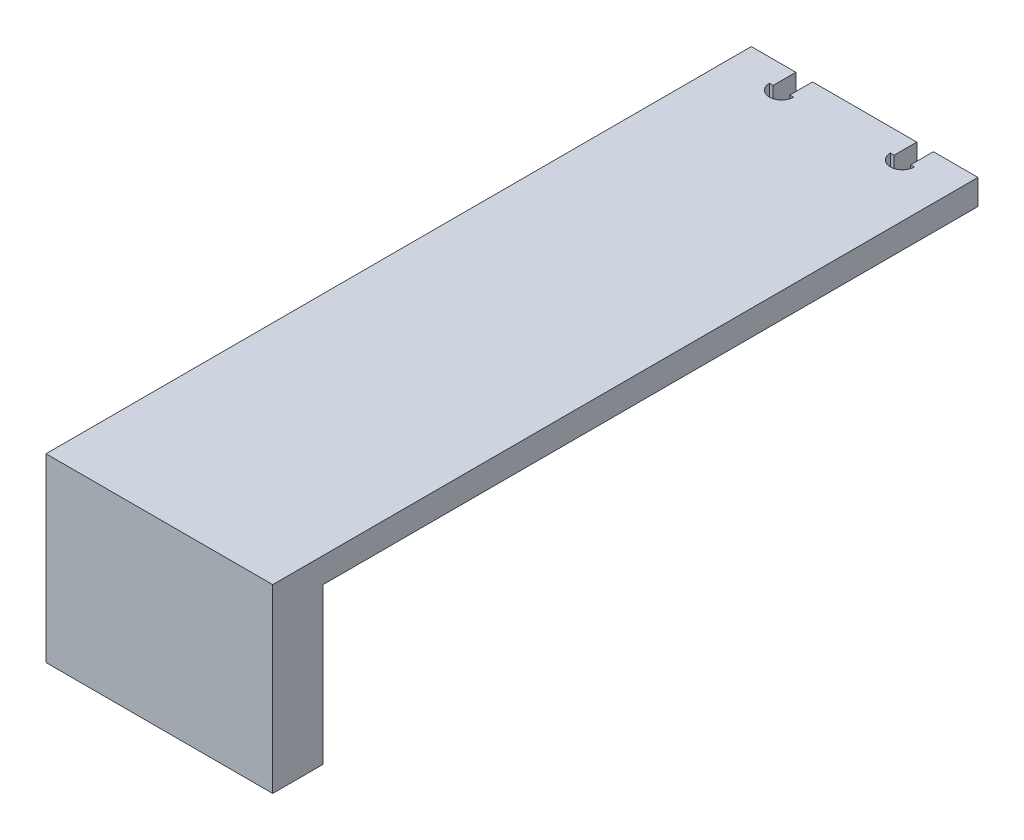
ISO-10303-21;
HEADER;
FILE_DESCRIPTION(('STEP AP214'),'2;1');
FILE_NAME('part.step','',(''),(''),'','','');
FILE_SCHEMA(('AUTOMOTIVE_DESIGN { 1 0 10303 214 1 1 1 1 }'));
ENDSEC;
DATA;
#1=APPLICATION_CONTEXT('core data for automotive mechanical design processes');
#2=APPLICATION_PROTOCOL_DEFINITION('international standard','automotive_design',2000,#1);
#3=PRODUCT_CONTEXT('',#1,'mechanical');
#4=PRODUCT('Part','Part','',(#3));
#5=PRODUCT_RELATED_PRODUCT_CATEGORY('part','',(#4));
#6=PRODUCT_DEFINITION_FORMATION('','',#4);
#7=PRODUCT_DEFINITION_CONTEXT('part definition',#1,'design');
#8=PRODUCT_DEFINITION('design','',#6,#7);
#9=PRODUCT_DEFINITION_SHAPE('','',#8);
#10=(LENGTH_UNIT() NAMED_UNIT(*) SI_UNIT(.MILLI.,.METRE.));
#11=(NAMED_UNIT(*) PLANE_ANGLE_UNIT() SI_UNIT($,.RADIAN.));
#12=(NAMED_UNIT(*) SI_UNIT($,.STERADIAN.) SOLID_ANGLE_UNIT());
#13=UNCERTAINTY_MEASURE_WITH_UNIT(LENGTH_MEASURE(1.E-05),#10,'distance_accuracy_value','');
#14=(GEOMETRIC_REPRESENTATION_CONTEXT(3) GLOBAL_UNCERTAINTY_ASSIGNED_CONTEXT((#13)) GLOBAL_UNIT_ASSIGNED_CONTEXT((#10,
#11,#12)) REPRESENTATION_CONTEXT('',''));
#15=CARTESIAN_POINT('',(0.,0.,0.));
#16=DIRECTION('',(0.,0.,1.));
#17=DIRECTION('',(1.,0.,0.));
#18=AXIS2_PLACEMENT_3D('',#15,#16,#17);
#19=CARTESIAN_POINT('',(0.,2.5,-65.));
#20=DIRECTION('',(0.,0.,-1.));
#21=DIRECTION('',(-1.,0.,0.));
#22=AXIS2_PLACEMENT_3D('',#19,#20,#21);
#23=PLANE('',#22);
#24=DIRECTION('',(1.,0.,0.));
#25=VECTOR('',#24,1.);
#26=CARTESIAN_POINT('',(0.,-2.5,-65.));
#27=LINE('',#26,#25);
#28=CARTESIAN_POINT('',(-22.5,-2.5,-65.));
#29=VERTEX_POINT('',#28);
#30=CARTESIAN_POINT('',(-13.65,-2.5,-65.));
#31=VERTEX_POINT('',#30);
#32=EDGE_CURVE('E193',#29,#31,#27,.T.);
#33=ORIENTED_EDGE('',*,*,#32,.F.);
#34=DIRECTION('',(0.,1.,0.));
#35=VECTOR('',#34,1.);
#36=CARTESIAN_POINT('',(-22.5,-117.5,-65.));
#37=LINE('',#36,#35);
#38=CARTESIAN_POINT('',(-22.5,2.5,-65.));
#39=VERTEX_POINT('',#38);
#40=EDGE_CURVE('E55',#29,#39,#37,.T.);
#41=ORIENTED_EDGE('',*,*,#40,.T.);
#42=DIRECTION('',(1.,0.,0.));
#43=VECTOR('',#42,1.);
#44=CARTESIAN_POINT('',(0.,2.5,-65.));
#45=LINE('',#44,#43);
#46=CARTESIAN_POINT('',(-13.65,2.5,-65.));
#47=VERTEX_POINT('',#46);
#48=EDGE_CURVE('E147',#39,#47,#45,.T.);
#49=ORIENTED_EDGE('',*,*,#48,.T.);
#50=DIRECTION('',(0.,-1.,0.));
#51=VECTOR('',#50,1.);
#52=CARTESIAN_POINT('',(-13.65,2.5,-65.));
#53=LINE('',#52,#51);
#54=EDGE_CURVE('E150',#47,#31,#53,.T.);
#55=ORIENTED_EDGE('',*,*,#54,.T.);
#56=EDGE_LOOP('',(#33,#41,#49,#55));
#57=FACE_BOUND('',#56,.T.);
#58=ADVANCED_FACE('F41',(#57),#23,.T.);
#59=CARTESIAN_POINT('',(13.65,2.5,-65.));
#60=VERTEX_POINT('',#59);
#61=CARTESIAN_POINT('',(22.5,2.5,-65.));
#62=VERTEX_POINT('',#61);
#63=EDGE_CURVE('E155',#60,#62,#45,.T.);
#64=ORIENTED_EDGE('',*,*,#63,.T.);
#65=DIRECTION('',(0.,1.,0.));
#66=VECTOR('',#65,1.);
#67=CARTESIAN_POINT('',(22.5,-117.5,-65.));
#68=LINE('',#67,#66);
#69=CARTESIAN_POINT('',(22.5,-2.5,-65.));
#70=VERTEX_POINT('',#69);
#71=EDGE_CURVE('E242',#70,#62,#68,.T.);
#72=ORIENTED_EDGE('',*,*,#71,.F.);
#73=CARTESIAN_POINT('',(13.65,-2.5,-65.));
#74=VERTEX_POINT('',#73);
#75=EDGE_CURVE('E194',#74,#70,#27,.T.);
#76=ORIENTED_EDGE('',*,*,#75,.F.);
#77=DIRECTION('',(0.,-1.,0.));
#78=VECTOR('',#77,1.);
#79=CARTESIAN_POINT('',(13.65,2.5,-65.));
#80=LINE('',#79,#78);
#81=EDGE_CURVE('E165',#60,#74,#80,.T.);
#82=ORIENTED_EDGE('',*,*,#81,.F.);
#83=EDGE_LOOP('',(#64,#72,#76,#82));
#84=FACE_BOUND('',#83,.T.);
#85=ADVANCED_FACE('F254',(#84),#23,.T.);
#86=CARTESIAN_POINT('',(0.,2.5,0.));
#87=DIRECTION('',(0.,1.,0.));
#88=DIRECTION('',(0.,0.,1.));
#89=AXIS2_PLACEMENT_3D('',#86,#87,#88);
#90=PLANE('',#89);
#91=ORIENTED_EDGE('',*,*,#48,.F.);
#92=DIRECTION('',(0.,0.,1.));
#93=VECTOR('',#92,1.);
#94=CARTESIAN_POINT('',(-22.5,2.5,0.));
#95=LINE('',#94,#93);
#96=CARTESIAN_POINT('',(-22.5,2.5,75.));
#97=VERTEX_POINT('',#96);
#98=EDGE_CURVE('E255',#39,#97,#95,.T.);
#99=ORIENTED_EDGE('',*,*,#98,.T.);
#100=DIRECTION('',(-1.,0.,0.));
#101=VECTOR('',#100,1.);
#102=CARTESIAN_POINT('',(22.5,2.5,75.));
#103=LINE('',#102,#101);
#104=CARTESIAN_POINT('',(22.5,2.5,75.));
#105=VERTEX_POINT('',#104);
#106=EDGE_CURVE('E288',#105,#97,#103,.T.);
#107=ORIENTED_EDGE('',*,*,#106,.F.);
#108=DIRECTION('',(0.,0.,-1.));
#109=VECTOR('',#108,1.);
#110=CARTESIAN_POINT('',(22.5,2.5,0.));
#111=LINE('',#110,#109);
#112=EDGE_CURVE('E256',#105,#62,#111,.T.);
#113=ORIENTED_EDGE('',*,*,#112,.T.);
#114=ORIENTED_EDGE('',*,*,#63,.F.);
#115=DIRECTION('',(0.,0.,1.));
#116=VECTOR('',#115,1.);
#117=CARTESIAN_POINT('',(13.65,2.5,0.));
#118=LINE('',#117,#116);
#119=CARTESIAN_POINT('',(13.65,2.5,-60.5));
#120=VERTEX_POINT('',#119);
#121=EDGE_CURVE('E64',#60,#120,#118,.T.);
#122=ORIENTED_EDGE('',*,*,#121,.T.);
#123=DIRECTION('',(1.,0.,0.));
#124=VECTOR('',#123,1.);
#125=CARTESIAN_POINT('',(0.,2.5,-60.5));
#126=LINE('',#125,#124);
#127=CARTESIAN_POINT('',(14.4,2.5,-60.5));
#128=VERTEX_POINT('',#127);
#129=EDGE_CURVE('E211',#120,#128,#126,.T.);
#130=ORIENTED_EDGE('',*,*,#129,.T.);
#131=CARTESIAN_POINT('',(12.,2.5,-60.5));
#132=DIRECTION('',(0.,1.,0.));
#133=DIRECTION('',(0.,0.,1.));
#134=AXIS2_PLACEMENT_3D('',#131,#132,#133);
#135=CIRCLE('',#134,2.4);
#136=CARTESIAN_POINT('',(9.60000000000001,2.5,-60.5));
#137=VERTEX_POINT('',#136);
#138=EDGE_CURVE('E118',#128,#137,#135,.F.);
#139=ORIENTED_EDGE('',*,*,#138,.T.);
#140=DIRECTION('',(1.,0.,0.));
#141=VECTOR('',#140,1.);
#142=CARTESIAN_POINT('',(0.,2.5,-60.5));
#143=LINE('',#142,#141);
#144=CARTESIAN_POINT('',(10.35,2.5,-60.5));
#145=VERTEX_POINT('',#144);
#146=EDGE_CURVE('E296',#137,#145,#143,.T.);
#147=ORIENTED_EDGE('',*,*,#146,.T.);
#148=DIRECTION('',(0.,0.,-1.));
#149=VECTOR('',#148,1.);
#150=CARTESIAN_POINT('',(10.35,2.5,0.));
#151=LINE('',#150,#149);
#152=CARTESIAN_POINT('',(10.35,2.5,-65.));
#153=VERTEX_POINT('',#152);
#154=EDGE_CURVE('E298',#145,#153,#151,.T.);
#155=ORIENTED_EDGE('',*,*,#154,.T.);
#156=CARTESIAN_POINT('',(-10.35,2.5,-65.));
#157=VERTEX_POINT('',#156);
#158=EDGE_CURVE('E158',#157,#153,#45,.T.);
#159=ORIENTED_EDGE('',*,*,#158,.F.);
#160=DIRECTION('',(0.,0.,-1.));
#161=VECTOR('',#160,1.);
#162=CARTESIAN_POINT('',(-10.35,2.5,0.));
#163=LINE('',#162,#161);
#164=CARTESIAN_POINT('',(-10.35,2.5,-60.5));
#165=VERTEX_POINT('',#164);
#166=EDGE_CURVE('E301',#165,#157,#163,.T.);
#167=ORIENTED_EDGE('',*,*,#166,.F.);
#168=DIRECTION('',(-1.,0.,0.));
#169=VECTOR('',#168,1.);
#170=CARTESIAN_POINT('',(0.,2.5,-60.5));
#171=LINE('',#170,#169);
#172=CARTESIAN_POINT('',(-9.6,2.5,-60.5));
#173=VERTEX_POINT('',#172);
#174=EDGE_CURVE('E304',#173,#165,#171,.T.);
#175=ORIENTED_EDGE('',*,*,#174,.F.);
#176=CARTESIAN_POINT('',(-12.,2.5,-60.5));
#177=DIRECTION('',(0.,1.,0.));
#178=DIRECTION('',(0.,0.,1.));
#179=AXIS2_PLACEMENT_3D('',#176,#177,#178);
#180=CIRCLE('',#179,2.4);
#181=CARTESIAN_POINT('',(-14.4,2.5,-60.5));
#182=VERTEX_POINT('',#181);
#183=EDGE_CURVE('E173',#182,#173,#180,.T.);
#184=ORIENTED_EDGE('',*,*,#183,.F.);
#185=DIRECTION('',(-1.,0.,0.));
#186=VECTOR('',#185,1.);
#187=CARTESIAN_POINT('',(0.,2.5,-60.5));
#188=LINE('',#187,#186);
#189=CARTESIAN_POINT('',(-13.65,2.5,-60.5));
#190=VERTEX_POINT('',#189);
#191=EDGE_CURVE('E171',#190,#182,#188,.T.);
#192=ORIENTED_EDGE('',*,*,#191,.F.);
#193=DIRECTION('',(0.,0.,1.));
#194=VECTOR('',#193,1.);
#195=CARTESIAN_POINT('',(-13.65,2.5,0.));
#196=LINE('',#195,#194);
#197=EDGE_CURVE('E156',#47,#190,#196,.T.);
#198=ORIENTED_EDGE('',*,*,#197,.F.);
#199=EDGE_LOOP('',(#91,#99,#107,#113,#114,#122,#130,#139,#147,#155,#159,#167,#175,#184,#192,#198));
#200=FACE_BOUND('',#199,.T.);
#201=ADVANCED_FACE('F168',(#200),#90,.T.);
#202=CARTESIAN_POINT('',(0.,-2.5,0.));
#203=DIRECTION('',(0.,1.,0.));
#204=DIRECTION('',(0.,0.,1.));
#205=AXIS2_PLACEMENT_3D('',#202,#203,#204);
#206=PLANE('',#205);
#207=DIRECTION('',(0.,0.,1.));
#208=VECTOR('',#207,1.);
#209=CARTESIAN_POINT('',(-22.5,-2.5,0.));
#210=LINE('',#209,#208);
#211=CARTESIAN_POINT('',(-22.5,-2.5,65.));
#212=VERTEX_POINT('',#211);
#213=EDGE_CURVE('E11',#29,#212,#210,.T.);
#214=ORIENTED_EDGE('',*,*,#213,.F.);
#215=ORIENTED_EDGE('',*,*,#32,.T.);
#216=DIRECTION('',(0.,0.,1.));
#217=VECTOR('',#216,1.);
#218=CARTESIAN_POINT('',(-13.65,-2.5,0.));
#219=LINE('',#218,#217);
#220=CARTESIAN_POINT('',(-13.65,-2.5,-60.5));
#221=VERTEX_POINT('',#220);
#222=EDGE_CURVE('E163',#31,#221,#219,.T.);
#223=ORIENTED_EDGE('',*,*,#222,.T.);
#224=DIRECTION('',(-1.,0.,0.));
#225=VECTOR('',#224,1.);
#226=CARTESIAN_POINT('',(0.,-2.5,-60.5));
#227=LINE('',#226,#225);
#228=CARTESIAN_POINT('',(-14.4,-2.5,-60.5));
#229=VERTEX_POINT('',#228);
#230=EDGE_CURVE('E203',#221,#229,#227,.T.);
#231=ORIENTED_EDGE('',*,*,#230,.T.);
#232=CARTESIAN_POINT('',(-12.,-2.5,-60.5));
#233=DIRECTION('',(0.,1.,0.));
#234=DIRECTION('',(0.,0.,1.));
#235=AXIS2_PLACEMENT_3D('',#232,#233,#234);
#236=CIRCLE('',#235,2.4);
#237=CARTESIAN_POINT('',(-9.6,-2.5,-60.5));
#238=VERTEX_POINT('',#237);
#239=EDGE_CURVE('E200',#229,#238,#236,.T.);
#240=ORIENTED_EDGE('',*,*,#239,.T.);
#241=DIRECTION('',(-1.,0.,0.));
#242=VECTOR('',#241,1.);
#243=CARTESIAN_POINT('',(0.,-2.5,-60.5));
#244=LINE('',#243,#242);
#245=CARTESIAN_POINT('',(-10.35,-2.5,-60.5));
#246=VERTEX_POINT('',#245);
#247=EDGE_CURVE('E197',#238,#246,#244,.T.);
#248=ORIENTED_EDGE('',*,*,#247,.T.);
#249=DIRECTION('',(0.,0.,-1.));
#250=VECTOR('',#249,1.);
#251=CARTESIAN_POINT('',(-10.35,-2.5,0.));
#252=LINE('',#251,#250);
#253=CARTESIAN_POINT('',(-10.35,-2.5,-65.));
#254=VERTEX_POINT('',#253);
#255=EDGE_CURVE('E192',#246,#254,#252,.T.);
#256=ORIENTED_EDGE('',*,*,#255,.T.);
#257=CARTESIAN_POINT('',(10.35,-2.5,-65.));
#258=VERTEX_POINT('',#257);
#259=EDGE_CURVE('E189',#254,#258,#27,.T.);
#260=ORIENTED_EDGE('',*,*,#259,.T.);
#261=DIRECTION('',(0.,0.,-1.));
#262=VECTOR('',#261,1.);
#263=CARTESIAN_POINT('',(10.35,-2.5,0.));
#264=LINE('',#263,#262);
#265=CARTESIAN_POINT('',(10.35,-2.5,-60.5));
#266=VERTEX_POINT('',#265);
#267=EDGE_CURVE('E186',#266,#258,#264,.T.);
#268=ORIENTED_EDGE('',*,*,#267,.F.);
#269=DIRECTION('',(1.,0.,0.));
#270=VECTOR('',#269,1.);
#271=CARTESIAN_POINT('',(0.,-2.5,-60.5));
#272=LINE('',#271,#270);
#273=CARTESIAN_POINT('',(9.60000000000001,-2.5,-60.5));
#274=VERTEX_POINT('',#273);
#275=EDGE_CURVE('E184',#274,#266,#272,.T.);
#276=ORIENTED_EDGE('',*,*,#275,.F.);
#277=CARTESIAN_POINT('',(12.,-2.5,-60.5));
#278=DIRECTION('',(0.,1.,0.));
#279=DIRECTION('',(0.,0.,1.));
#280=AXIS2_PLACEMENT_3D('',#277,#278,#279);
#281=CIRCLE('',#280,2.4);
#282=CARTESIAN_POINT('',(14.4,-2.5,-60.5));
#283=VERTEX_POINT('',#282);
#284=EDGE_CURVE('E182',#283,#274,#281,.F.);
#285=ORIENTED_EDGE('',*,*,#284,.F.);
#286=DIRECTION('',(1.,0.,0.));
#287=VECTOR('',#286,1.);
#288=CARTESIAN_POINT('',(0.,-2.5,-60.5));
#289=LINE('',#288,#287);
#290=CARTESIAN_POINT('',(13.65,-2.5,-60.5));
#291=VERTEX_POINT('',#290);
#292=EDGE_CURVE('E179',#291,#283,#289,.T.);
#293=ORIENTED_EDGE('',*,*,#292,.F.);
#294=DIRECTION('',(0.,0.,1.));
#295=VECTOR('',#294,1.);
#296=CARTESIAN_POINT('',(13.65,-2.5,0.));
#297=LINE('',#296,#295);
#298=EDGE_CURVE('E109',#74,#291,#297,.T.);
#299=ORIENTED_EDGE('',*,*,#298,.F.);
#300=ORIENTED_EDGE('',*,*,#75,.T.);
#301=DIRECTION('',(0.,0.,-1.));
#302=VECTOR('',#301,1.);
#303=CARTESIAN_POINT('',(22.5,-2.5,0.));
#304=LINE('',#303,#302);
#305=CARTESIAN_POINT('',(22.5,-2.5,65.));
#306=VERTEX_POINT('',#305);
#307=EDGE_CURVE('E49',#306,#70,#304,.T.);
#308=ORIENTED_EDGE('',*,*,#307,.F.);
#309=DIRECTION('',(1.,0.,0.));
#310=VECTOR('',#309,1.);
#311=CARTESIAN_POINT('',(0.,-2.5,65.));
#312=LINE('',#311,#310);
#313=EDGE_CURVE('E207',#212,#306,#312,.T.);
#314=ORIENTED_EDGE('',*,*,#313,.F.);
#315=EDGE_LOOP('',(#214,#215,#223,#231,#240,#248,#256,#260,#268,#276,#285,#293,#299,#300,#308,#314));
#316=FACE_BOUND('',#315,.T.);
#317=ADVANCED_FACE('F258',(#316),#206,.F.);
#318=CARTESIAN_POINT('',(0.,2.5,-60.5));
#319=DIRECTION('',(0.,0.,-1.));
#320=DIRECTION('',(-1.,0.,0.));
#321=AXIS2_PLACEMENT_3D('',#318,#319,#320);
#322=PLANE('',#321);
#323=ORIENTED_EDGE('',*,*,#292,.T.);
#324=DIRECTION('',(0.,-1.,0.));
#325=VECTOR('',#324,1.);
#326=CARTESIAN_POINT('',(14.4,2.5,-60.5));
#327=LINE('',#326,#325);
#328=EDGE_CURVE('E231',#128,#283,#327,.T.);
#329=ORIENTED_EDGE('',*,*,#328,.F.);
#330=ORIENTED_EDGE('',*,*,#129,.F.);
#331=DIRECTION('',(0.,-1.,0.));
#332=VECTOR('',#331,1.);
#333=CARTESIAN_POINT('',(13.65,2.5,-60.5));
#334=LINE('',#333,#332);
#335=EDGE_CURVE('E178',#120,#291,#334,.T.);
#336=ORIENTED_EDGE('',*,*,#335,.T.);
#337=EDGE_LOOP('',(#323,#329,#330,#336));
#338=FACE_BOUND('',#337,.T.);
#339=ADVANCED_FACE('F43',(#338),#322,.F.);
#340=CARTESIAN_POINT('',(12.,2.5,-60.5));
#341=DIRECTION('',(0.,-1.,0.));
#342=DIRECTION('',(0.,0.,-1.));
#343=AXIS2_PLACEMENT_3D('',#340,#341,#342);
#344=CYLINDRICAL_SURFACE('',#343,2.4);
#345=ORIENTED_EDGE('',*,*,#284,.T.);
#346=DIRECTION('',(0.,-1.,0.));
#347=VECTOR('',#346,1.);
#348=CARTESIAN_POINT('',(9.60000000000001,2.5,-60.5));
#349=LINE('',#348,#347);
#350=EDGE_CURVE('E228',#137,#274,#349,.T.);
#351=ORIENTED_EDGE('',*,*,#350,.F.);
#352=ORIENTED_EDGE('',*,*,#138,.F.);
#353=ORIENTED_EDGE('',*,*,#328,.T.);
#354=EDGE_LOOP('',(#345,#351,#352,#353));
#355=FACE_BOUND('',#354,.T.);
#356=ADVANCED_FACE('F335',(#355),#344,.F.);
#357=CARTESIAN_POINT('',(0.,2.5,-60.5));
#358=DIRECTION('',(0.,0.,-1.));
#359=DIRECTION('',(-1.,0.,0.));
#360=AXIS2_PLACEMENT_3D('',#357,#358,#359);
#361=PLANE('',#360);
#362=ORIENTED_EDGE('',*,*,#275,.T.);
#363=DIRECTION('',(0.,-1.,0.));
#364=VECTOR('',#363,1.);
#365=CARTESIAN_POINT('',(10.35,2.5,-60.5));
#366=LINE('',#365,#364);
#367=EDGE_CURVE('E225',#145,#266,#366,.T.);
#368=ORIENTED_EDGE('',*,*,#367,.F.);
#369=ORIENTED_EDGE('',*,*,#146,.F.);
#370=ORIENTED_EDGE('',*,*,#350,.T.);
#371=EDGE_LOOP('',(#362,#368,#369,#370));
#372=FACE_BOUND('',#371,.T.);
#373=ADVANCED_FACE('F334',(#372),#361,.F.);
#374=CARTESIAN_POINT('',(10.35,2.5,0.));
#375=DIRECTION('',(-1.,0.,0.));
#376=DIRECTION('',(0.,0.,1.));
#377=AXIS2_PLACEMENT_3D('',#374,#375,#376);
#378=PLANE('',#377);
#379=ORIENTED_EDGE('',*,*,#267,.T.);
#380=DIRECTION('',(0.,-1.,0.));
#381=VECTOR('',#380,1.);
#382=CARTESIAN_POINT('',(10.35,2.5,-65.));
#383=LINE('',#382,#381);
#384=EDGE_CURVE('E223',#153,#258,#383,.T.);
#385=ORIENTED_EDGE('',*,*,#384,.F.);
#386=ORIENTED_EDGE('',*,*,#154,.F.);
#387=ORIENTED_EDGE('',*,*,#367,.T.);
#388=EDGE_LOOP('',(#379,#385,#386,#387));
#389=FACE_BOUND('',#388,.T.);
#390=ADVANCED_FACE('F329',(#389),#378,.F.);
#391=ORIENTED_EDGE('',*,*,#259,.F.);
#392=DIRECTION('',(0.,-1.,0.));
#393=VECTOR('',#392,1.);
#394=CARTESIAN_POINT('',(-10.35,2.5,-65.));
#395=LINE('',#394,#393);
#396=EDGE_CURVE('E221',#157,#254,#395,.T.);
#397=ORIENTED_EDGE('',*,*,#396,.F.);
#398=ORIENTED_EDGE('',*,*,#158,.T.);
#399=ORIENTED_EDGE('',*,*,#384,.T.);
#400=EDGE_LOOP('',(#391,#397,#398,#399));
#401=FACE_BOUND('',#400,.T.);
#402=ADVANCED_FACE('F324',(#401),#23,.T.);
#403=CARTESIAN_POINT('',(-10.35,2.5,0.));
#404=DIRECTION('',(-1.,0.,0.));
#405=DIRECTION('',(0.,0.,1.));
#406=AXIS2_PLACEMENT_3D('',#403,#404,#405);
#407=PLANE('',#406);
#408=ORIENTED_EDGE('',*,*,#255,.F.);
#409=DIRECTION('',(0.,-1.,0.));
#410=VECTOR('',#409,1.);
#411=CARTESIAN_POINT('',(-10.35,2.5,-60.5));
#412=LINE('',#411,#410);
#413=EDGE_CURVE('E219',#165,#246,#412,.T.);
#414=ORIENTED_EDGE('',*,*,#413,.F.);
#415=ORIENTED_EDGE('',*,*,#166,.T.);
#416=ORIENTED_EDGE('',*,*,#396,.T.);
#417=EDGE_LOOP('',(#408,#414,#415,#416));
#418=FACE_BOUND('',#417,.T.);
#419=ADVANCED_FACE('F320',(#418),#407,.T.);
#420=CARTESIAN_POINT('',(0.,2.5,-60.5));
#421=DIRECTION('',(0.,0.,1.));
#422=DIRECTION('',(1.,0.,0.));
#423=AXIS2_PLACEMENT_3D('',#420,#421,#422);
#424=PLANE('',#423);
#425=ORIENTED_EDGE('',*,*,#247,.F.);
#426=DIRECTION('',(0.,-1.,0.));
#427=VECTOR('',#426,1.);
#428=CARTESIAN_POINT('',(-9.6,2.5,-60.5));
#429=LINE('',#428,#427);
#430=EDGE_CURVE('E217',#173,#238,#429,.T.);
#431=ORIENTED_EDGE('',*,*,#430,.F.);
#432=ORIENTED_EDGE('',*,*,#174,.T.);
#433=ORIENTED_EDGE('',*,*,#413,.T.);
#434=EDGE_LOOP('',(#425,#431,#432,#433));
#435=FACE_BOUND('',#434,.T.);
#436=ADVANCED_FACE('F318',(#435),#424,.T.);
#437=CARTESIAN_POINT('',(-12.,2.5,-60.5));
#438=DIRECTION('',(0.,-1.,0.));
#439=DIRECTION('',(0.,0.,-1.));
#440=AXIS2_PLACEMENT_3D('',#437,#438,#439);
#441=CYLINDRICAL_SURFACE('',#440,2.4);
#442=ORIENTED_EDGE('',*,*,#239,.F.);
#443=DIRECTION('',(0.,-1.,0.));
#444=VECTOR('',#443,1.);
#445=CARTESIAN_POINT('',(-14.4,2.5,-60.5));
#446=LINE('',#445,#444);
#447=EDGE_CURVE('E215',#182,#229,#446,.T.);
#448=ORIENTED_EDGE('',*,*,#447,.F.);
#449=ORIENTED_EDGE('',*,*,#183,.T.);
#450=ORIENTED_EDGE('',*,*,#430,.T.);
#451=EDGE_LOOP('',(#442,#448,#449,#450));
#452=FACE_BOUND('',#451,.T.);
#453=ADVANCED_FACE('F309',(#452),#441,.F.);
#454=CARTESIAN_POINT('',(0.,2.5,-60.5));
#455=DIRECTION('',(0.,0.,1.));
#456=DIRECTION('',(1.,0.,0.));
#457=AXIS2_PLACEMENT_3D('',#454,#455,#456);
#458=PLANE('',#457);
#459=ORIENTED_EDGE('',*,*,#230,.F.);
#460=DIRECTION('',(0.,-1.,0.));
#461=VECTOR('',#460,1.);
#462=CARTESIAN_POINT('',(-13.65,2.5,-60.5));
#463=LINE('',#462,#461);
#464=EDGE_CURVE('E164',#190,#221,#463,.T.);
#465=ORIENTED_EDGE('',*,*,#464,.F.);
#466=ORIENTED_EDGE('',*,*,#191,.T.);
#467=ORIENTED_EDGE('',*,*,#447,.T.);
#468=EDGE_LOOP('',(#459,#465,#466,#467));
#469=FACE_BOUND('',#468,.T.);
#470=ADVANCED_FACE('F315',(#469),#458,.T.);
#471=CARTESIAN_POINT('',(-13.65,2.5,0.));
#472=DIRECTION('',(1.,0.,0.));
#473=DIRECTION('',(0.,0.,-1.));
#474=AXIS2_PLACEMENT_3D('',#471,#472,#473);
#475=PLANE('',#474);
#476=ORIENTED_EDGE('',*,*,#222,.F.);
#477=ORIENTED_EDGE('',*,*,#54,.F.);
#478=ORIENTED_EDGE('',*,*,#197,.T.);
#479=ORIENTED_EDGE('',*,*,#464,.T.);
#480=EDGE_LOOP('',(#476,#477,#478,#479));
#481=FACE_BOUND('',#480,.T.);
#482=ADVANCED_FACE('F161',(#481),#475,.T.);
#483=CARTESIAN_POINT('',(13.65,2.5,0.));
#484=DIRECTION('',(1.,0.,0.));
#485=DIRECTION('',(0.,0.,-1.));
#486=AXIS2_PLACEMENT_3D('',#483,#484,#485);
#487=PLANE('',#486);
#488=ORIENTED_EDGE('',*,*,#298,.T.);
#489=ORIENTED_EDGE('',*,*,#335,.F.);
#490=ORIENTED_EDGE('',*,*,#121,.F.);
#491=ORIENTED_EDGE('',*,*,#81,.T.);
#492=EDGE_LOOP('',(#488,#489,#490,#491));
#493=FACE_BOUND('',#492,.T.);
#494=ADVANCED_FACE('F339',(#493),#487,.F.);
#495=CARTESIAN_POINT('',(22.5,-117.5,0.));
#496=DIRECTION('',(1.,0.,0.));
#497=DIRECTION('',(0.,0.,-1.));
#498=AXIS2_PLACEMENT_3D('',#495,#496,#497);
#499=PLANE('',#498);
#500=ORIENTED_EDGE('',*,*,#307,.T.);
#501=ORIENTED_EDGE('',*,*,#71,.T.);
#502=ORIENTED_EDGE('',*,*,#112,.F.);
#503=DIRECTION('',(0.,-1.,0.));
#504=VECTOR('',#503,1.);
#505=CARTESIAN_POINT('',(22.5,2.5,75.));
#506=LINE('',#505,#504);
#507=CARTESIAN_POINT('',(22.5,-33.4,75.));
#508=VERTEX_POINT('',#507);
#509=EDGE_CURVE('E345',#105,#508,#506,.T.);
#510=ORIENTED_EDGE('',*,*,#509,.T.);
#511=DIRECTION('',(0.,0.,-1.));
#512=VECTOR('',#511,1.);
#513=CARTESIAN_POINT('',(22.5,-33.4,65.));
#514=LINE('',#513,#512);
#515=CARTESIAN_POINT('',(22.5,-33.4,65.));
#516=VERTEX_POINT('',#515);
#517=EDGE_CURVE('E279',#508,#516,#514,.T.);
#518=ORIENTED_EDGE('',*,*,#517,.T.);
#519=DIRECTION('',(0.,1.,0.));
#520=VECTOR('',#519,1.);
#521=CARTESIAN_POINT('',(22.5,2.5,65.));
#522=LINE('',#521,#520);
#523=EDGE_CURVE('E247',#516,#306,#522,.T.);
#524=ORIENTED_EDGE('',*,*,#523,.T.);
#525=EDGE_LOOP('',(#500,#501,#502,#510,#518,#524));
#526=FACE_BOUND('',#525,.T.);
#527=ADVANCED_FACE('F239',(#526),#499,.T.);
#528=CARTESIAN_POINT('',(-22.5,-117.5,0.));
#529=DIRECTION('',(-1.,0.,0.));
#530=DIRECTION('',(0.,0.,1.));
#531=AXIS2_PLACEMENT_3D('',#528,#529,#530);
#532=PLANE('',#531);
#533=ORIENTED_EDGE('',*,*,#213,.T.);
#534=DIRECTION('',(0.,1.,0.));
#535=VECTOR('',#534,1.);
#536=CARTESIAN_POINT('',(-22.5,2.5,65.));
#537=LINE('',#536,#535);
#538=CARTESIAN_POINT('',(-22.5,-33.4,65.));
#539=VERTEX_POINT('',#538);
#540=EDGE_CURVE('E265',#539,#212,#537,.T.);
#541=ORIENTED_EDGE('',*,*,#540,.F.);
#542=DIRECTION('',(0.,0.,-1.));
#543=VECTOR('',#542,1.);
#544=CARTESIAN_POINT('',(-22.5,-33.4,65.));
#545=LINE('',#544,#543);
#546=CARTESIAN_POINT('',(-22.5,-33.4,75.));
#547=VERTEX_POINT('',#546);
#548=EDGE_CURVE('E269',#547,#539,#545,.T.);
#549=ORIENTED_EDGE('',*,*,#548,.F.);
#550=DIRECTION('',(0.,-1.,0.));
#551=VECTOR('',#550,1.);
#552=CARTESIAN_POINT('',(-22.5,2.5,75.));
#553=LINE('',#552,#551);
#554=EDGE_CURVE('E274',#97,#547,#553,.T.);
#555=ORIENTED_EDGE('',*,*,#554,.F.);
#556=ORIENTED_EDGE('',*,*,#98,.F.);
#557=ORIENTED_EDGE('',*,*,#40,.F.);
#558=EDGE_LOOP('',(#533,#541,#549,#555,#556,#557));
#559=FACE_BOUND('',#558,.T.);
#560=ADVANCED_FACE('F262',(#559),#532,.T.);
#561=CARTESIAN_POINT('',(22.5,2.5,65.));
#562=DIRECTION('',(0.,0.,1.));
#563=DIRECTION('',(0.,-1.,0.));
#564=AXIS2_PLACEMENT_3D('',#561,#562,#563);
#565=PLANE('',#564);
#566=ORIENTED_EDGE('',*,*,#540,.T.);
#567=ORIENTED_EDGE('',*,*,#313,.T.);
#568=ORIENTED_EDGE('',*,*,#523,.F.);
#569=DIRECTION('',(-1.,0.,0.));
#570=VECTOR('',#569,1.);
#571=CARTESIAN_POINT('',(22.5,-33.4,65.));
#572=LINE('',#571,#570);
#573=EDGE_CURVE('E283',#516,#539,#572,.T.);
#574=ORIENTED_EDGE('',*,*,#573,.T.);
#575=EDGE_LOOP('',(#566,#567,#568,#574));
#576=FACE_BOUND('',#575,.T.);
#577=ADVANCED_FACE('F363',(#576),#565,.F.);
#578=CARTESIAN_POINT('',(22.5,2.5,75.));
#579=DIRECTION('',(0.,0.,-1.));
#580=DIRECTION('',(-1.,0.,0.));
#581=AXIS2_PLACEMENT_3D('',#578,#579,#580);
#582=PLANE('',#581);
#583=ORIENTED_EDGE('',*,*,#554,.T.);
#584=DIRECTION('',(-1.,0.,0.));
#585=VECTOR('',#584,1.);
#586=CARTESIAN_POINT('',(22.5,-33.4,75.));
#587=LINE('',#586,#585);
#588=EDGE_CURVE('E285',#508,#547,#587,.T.);
#589=ORIENTED_EDGE('',*,*,#588,.F.);
#590=ORIENTED_EDGE('',*,*,#509,.F.);
#591=ORIENTED_EDGE('',*,*,#106,.T.);
#592=EDGE_LOOP('',(#583,#589,#590,#591));
#593=FACE_BOUND('',#592,.T.);
#594=ADVANCED_FACE('F357',(#593),#582,.F.);
#595=CARTESIAN_POINT('',(22.5,-33.4,65.));
#596=DIRECTION('',(0.,1.,0.));
#597=DIRECTION('',(0.,0.,1.));
#598=AXIS2_PLACEMENT_3D('',#595,#596,#597);
#599=PLANE('',#598);
#600=ORIENTED_EDGE('',*,*,#548,.T.);
#601=ORIENTED_EDGE('',*,*,#573,.F.);
#602=ORIENTED_EDGE('',*,*,#517,.F.);
#603=ORIENTED_EDGE('',*,*,#588,.T.);
#604=EDGE_LOOP('',(#600,#601,#602,#603));
#605=FACE_BOUND('',#604,.T.);
#606=ADVANCED_FACE('F362',(#605),#599,.F.);
#607=CLOSED_SHELL('',(#58,#85,#201,#317,#339,#356,#373,#390,#402,#419,#436,#453,#470,#482,#494,
#527,#560,#577,#594,#606));
#608=MANIFOLD_SOLID_BREP('B2',#607);
#609=ADVANCED_BREP_SHAPE_REPRESENTATION('',(#18,#608),#14);
#610=SHAPE_DEFINITION_REPRESENTATION(#9,#609);
ENDSEC;
END-ISO-10303-21;
